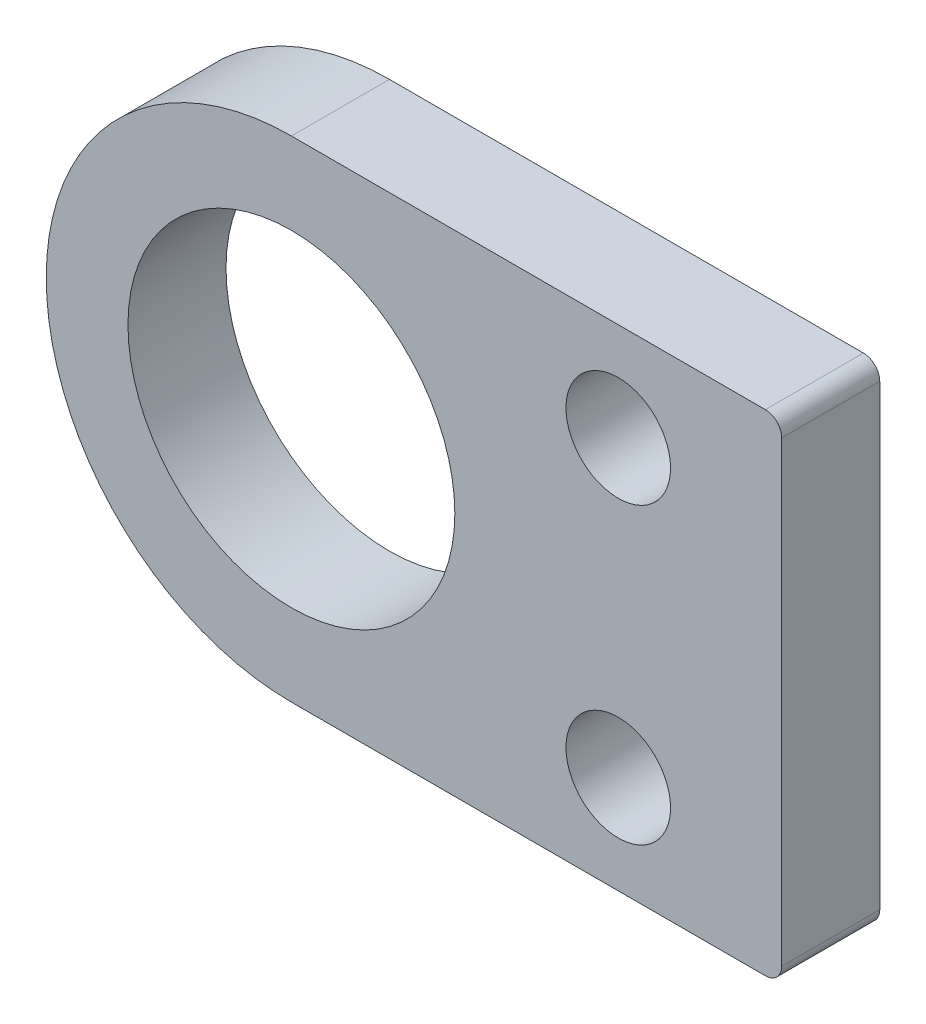
ISO-10303-21;
HEADER;
FILE_DESCRIPTION(('STEP AP214'),'2;1');
FILE_NAME('part.step','',(''),(''),'','','');
FILE_SCHEMA(('AUTOMOTIVE_DESIGN { 1 0 10303 214 1 1 1 1 }'));
ENDSEC;
DATA;
#1=APPLICATION_CONTEXT('core data for automotive mechanical design processes');
#2=APPLICATION_PROTOCOL_DEFINITION('international standard','automotive_design',2000,#1);
#3=PRODUCT_CONTEXT('',#1,'mechanical');
#4=PRODUCT('Part','Part','',(#3));
#5=PRODUCT_RELATED_PRODUCT_CATEGORY('part','',(#4));
#6=PRODUCT_DEFINITION_FORMATION('','',#4);
#7=PRODUCT_DEFINITION_CONTEXT('part definition',#1,'design');
#8=PRODUCT_DEFINITION('design','',#6,#7);
#9=PRODUCT_DEFINITION_SHAPE('','',#8);
#10=(LENGTH_UNIT() NAMED_UNIT(*) SI_UNIT(.MILLI.,.METRE.));
#11=(NAMED_UNIT(*) PLANE_ANGLE_UNIT() SI_UNIT($,.RADIAN.));
#12=(NAMED_UNIT(*) SI_UNIT($,.STERADIAN.) SOLID_ANGLE_UNIT());
#13=UNCERTAINTY_MEASURE_WITH_UNIT(LENGTH_MEASURE(1.E-05),#10,'distance_accuracy_value','');
#14=(GEOMETRIC_REPRESENTATION_CONTEXT(3) GLOBAL_UNCERTAINTY_ASSIGNED_CONTEXT((#13)) GLOBAL_UNIT_ASSIGNED_CONTEXT((#10,
#11,#12)) REPRESENTATION_CONTEXT('',''));
#15=CARTESIAN_POINT('',(0.,0.,0.));
#16=DIRECTION('',(0.,0.,1.));
#17=DIRECTION('',(1.,0.,0.));
#18=AXIS2_PLACEMENT_3D('',#15,#16,#17);
#19=CARTESIAN_POINT('',(0.,0.,3.));
#20=DIRECTION('',(0.,0.,1.));
#21=DIRECTION('',(1.,0.,0.));
#22=AXIS2_PLACEMENT_3D('',#19,#20,#21);
#23=PLANE('',#22);
#24=CARTESIAN_POINT('',(10.,4.5,3.));
#25=DIRECTION('',(0.,0.,1.));
#26=DIRECTION('',(1.,0.,0.));
#27=AXIS2_PLACEMENT_3D('',#24,#25,#26);
#28=CIRCLE('',#27,1.6);
#29=CARTESIAN_POINT('',(11.6,4.5,3.));
#30=VERTEX_POINT('',#29);
#31=EDGE_CURVE('E254',#30,#30,#28,.T.);
#32=ORIENTED_EDGE('',*,*,#31,.F.);
#33=EDGE_LOOP('',(#32));
#34=FACE_BOUND('',#33,.T.);
#35=DIRECTION('',(1.,0.,0.));
#36=VECTOR('',#35,1.);
#37=CARTESIAN_POINT('',(0.,-7.5,3.));
#38=LINE('',#37,#36);
#39=CARTESIAN_POINT('',(0.,-7.5,3.));
#40=VERTEX_POINT('',#39);
#41=CARTESIAN_POINT('',(14.5,-7.5,3.));
#42=VERTEX_POINT('',#41);
#43=EDGE_CURVE('E87',#40,#42,#38,.T.);
#44=ORIENTED_EDGE('',*,*,#43,.T.);
#45=CARTESIAN_POINT('',(14.5,-7.,3.));
#46=DIRECTION('',(0.,0.,1.));
#47=DIRECTION('',(1.,0.,0.));
#48=AXIS2_PLACEMENT_3D('',#45,#46,#47);
#49=CIRCLE('',#48,0.5);
#50=CARTESIAN_POINT('',(15.,-7.,3.));
#51=VERTEX_POINT('',#50);
#52=EDGE_CURVE('E42',#42,#51,#49,.T.);
#53=ORIENTED_EDGE('',*,*,#52,.T.);
#54=DIRECTION('',(0.,1.,0.));
#55=VECTOR('',#54,1.);
#56=CARTESIAN_POINT('',(15.,7.5,3.));
#57=LINE('',#56,#55);
#58=CARTESIAN_POINT('',(15.,7.,3.));
#59=VERTEX_POINT('',#58);
#60=EDGE_CURVE('E94',#51,#59,#57,.T.);
#61=ORIENTED_EDGE('',*,*,#60,.T.);
#62=CARTESIAN_POINT('',(14.5,7.,3.));
#63=DIRECTION('',(0.,0.,1.));
#64=DIRECTION('',(1.,0.,0.));
#65=AXIS2_PLACEMENT_3D('',#62,#63,#64);
#66=CIRCLE('',#65,0.5);
#67=CARTESIAN_POINT('',(14.5,7.5,3.));
#68=VERTEX_POINT('',#67);
#69=EDGE_CURVE('E49',#59,#68,#66,.T.);
#70=ORIENTED_EDGE('',*,*,#69,.T.);
#71=DIRECTION('',(-1.,0.,0.));
#72=VECTOR('',#71,1.);
#73=CARTESIAN_POINT('',(0.,7.5,3.));
#74=LINE('',#73,#72);
#75=CARTESIAN_POINT('',(0.,7.5,3.));
#76=VERTEX_POINT('',#75);
#77=EDGE_CURVE('E99',#68,#76,#74,.T.);
#78=ORIENTED_EDGE('',*,*,#77,.T.);
#79=CARTESIAN_POINT('',(0.,0.,3.));
#80=DIRECTION('',(0.,0.,1.));
#81=DIRECTION('',(1.,0.,0.));
#82=AXIS2_PLACEMENT_3D('',#79,#80,#81);
#83=CIRCLE('',#82,7.5);
#84=EDGE_CURVE('E95',#76,#40,#83,.T.);
#85=ORIENTED_EDGE('',*,*,#84,.T.);
#86=EDGE_LOOP('',(#44,#53,#61,#70,#78,#85));
#87=FACE_BOUND('',#86,.T.);
#88=CARTESIAN_POINT('',(0.,0.,3.));
#89=DIRECTION('',(0.,0.,1.));
#90=DIRECTION('',(1.,0.,0.));
#91=AXIS2_PLACEMENT_3D('',#88,#89,#90);
#92=CIRCLE('',#91,5.);
#93=CARTESIAN_POINT('',(5.,0.,3.));
#94=VERTEX_POINT('',#93);
#95=EDGE_CURVE('E140',#94,#94,#92,.T.);
#96=ORIENTED_EDGE('',*,*,#95,.F.);
#97=EDGE_LOOP('',(#96));
#98=FACE_BOUND('',#97,.T.);
#99=CARTESIAN_POINT('',(10.,-4.5,3.));
#100=DIRECTION('',(0.,0.,1.));
#101=DIRECTION('',(-1.,0.,0.));
#102=AXIS2_PLACEMENT_3D('',#99,#100,#101);
#103=CIRCLE('',#102,1.6);
#104=CARTESIAN_POINT('',(8.4,-4.5,3.));
#105=VERTEX_POINT('',#104);
#106=EDGE_CURVE('E245',#105,#105,#103,.T.);
#107=ORIENTED_EDGE('',*,*,#106,.F.);
#108=EDGE_LOOP('',(#107));
#109=FACE_BOUND('',#108,.T.);
#110=ADVANCED_FACE('F34',(#34,#87,#98,#109),#23,.T.);
#111=CARTESIAN_POINT('',(0.,0.,0.));
#112=DIRECTION('',(0.,0.,1.));
#113=DIRECTION('',(1.,0.,0.));
#114=AXIS2_PLACEMENT_3D('',#111,#112,#113);
#115=PLANE('',#114);
#116=DIRECTION('',(0.,1.,0.));
#117=VECTOR('',#116,1.);
#118=CARTESIAN_POINT('',(15.,7.5,0.));
#119=LINE('',#118,#117);
#120=CARTESIAN_POINT('',(15.,-7.,0.));
#121=VERTEX_POINT('',#120);
#122=CARTESIAN_POINT('',(15.,7.,0.));
#123=VERTEX_POINT('',#122);
#124=EDGE_CURVE('E137',#121,#123,#119,.T.);
#125=ORIENTED_EDGE('',*,*,#124,.F.);
#126=CARTESIAN_POINT('',(14.5,-7.,0.));
#127=DIRECTION('',(0.,0.,1.));
#128=DIRECTION('',(1.,0.,0.));
#129=AXIS2_PLACEMENT_3D('',#126,#127,#128);
#130=CIRCLE('',#129,0.5);
#131=CARTESIAN_POINT('',(14.5,-7.5,0.));
#132=VERTEX_POINT('',#131);
#133=EDGE_CURVE('E120',#121,#132,#130,.F.);
#134=ORIENTED_EDGE('',*,*,#133,.T.);
#135=DIRECTION('',(1.,0.,0.));
#136=VECTOR('',#135,1.);
#137=CARTESIAN_POINT('',(0.,-7.5,0.));
#138=LINE('',#137,#136);
#139=CARTESIAN_POINT('',(0.,-7.5,0.));
#140=VERTEX_POINT('',#139);
#141=EDGE_CURVE('E136',#140,#132,#138,.T.);
#142=ORIENTED_EDGE('',*,*,#141,.F.);
#143=CARTESIAN_POINT('',(0.,0.,0.));
#144=DIRECTION('',(0.,0.,1.));
#145=DIRECTION('',(1.,0.,0.));
#146=AXIS2_PLACEMENT_3D('',#143,#144,#145);
#147=CIRCLE('',#146,7.5);
#148=CARTESIAN_POINT('',(0.,7.5,0.));
#149=VERTEX_POINT('',#148);
#150=EDGE_CURVE('E107',#149,#140,#147,.T.);
#151=ORIENTED_EDGE('',*,*,#150,.F.);
#152=DIRECTION('',(-1.,0.,0.));
#153=VECTOR('',#152,1.);
#154=CARTESIAN_POINT('',(0.,7.5,0.));
#155=LINE('',#154,#153);
#156=CARTESIAN_POINT('',(14.5,7.5,0.));
#157=VERTEX_POINT('',#156);
#158=EDGE_CURVE('E103',#157,#149,#155,.T.);
#159=ORIENTED_EDGE('',*,*,#158,.F.);
#160=CARTESIAN_POINT('',(14.5,7.,0.));
#161=DIRECTION('',(0.,0.,1.));
#162=DIRECTION('',(1.,0.,0.));
#163=AXIS2_PLACEMENT_3D('',#160,#161,#162);
#164=CIRCLE('',#163,0.5);
#165=EDGE_CURVE('E118',#157,#123,#164,.F.);
#166=ORIENTED_EDGE('',*,*,#165,.T.);
#167=EDGE_LOOP('',(#125,#134,#142,#151,#159,#166));
#168=FACE_BOUND('',#167,.T.);
#169=CARTESIAN_POINT('',(0.,0.,0.));
#170=DIRECTION('',(0.,0.,1.));
#171=DIRECTION('',(1.,0.,0.));
#172=AXIS2_PLACEMENT_3D('',#169,#170,#171);
#173=CIRCLE('',#172,5.);
#174=CARTESIAN_POINT('',(5.,0.,0.));
#175=VERTEX_POINT('',#174);
#176=EDGE_CURVE('E257',#175,#175,#173,.T.);
#177=ORIENTED_EDGE('',*,*,#176,.T.);
#178=EDGE_LOOP('',(#177));
#179=FACE_BOUND('',#178,.T.);
#180=CARTESIAN_POINT('',(10.,4.5,0.));
#181=DIRECTION('',(0.,0.,1.));
#182=DIRECTION('',(1.,0.,0.));
#183=AXIS2_PLACEMENT_3D('',#180,#181,#182);
#184=CIRCLE('',#183,1.6);
#185=CARTESIAN_POINT('',(11.6,4.5,0.));
#186=VERTEX_POINT('',#185);
#187=EDGE_CURVE('E251',#186,#186,#184,.T.);
#188=ORIENTED_EDGE('',*,*,#187,.T.);
#189=EDGE_LOOP('',(#188));
#190=FACE_BOUND('',#189,.T.);
#191=CARTESIAN_POINT('',(10.,-4.5,0.));
#192=DIRECTION('',(0.,0.,1.));
#193=DIRECTION('',(-1.,0.,0.));
#194=AXIS2_PLACEMENT_3D('',#191,#192,#193);
#195=CIRCLE('',#194,1.6);
#196=CARTESIAN_POINT('',(8.4,-4.5,0.));
#197=VERTEX_POINT('',#196);
#198=EDGE_CURVE('E248',#197,#197,#195,.T.);
#199=ORIENTED_EDGE('',*,*,#198,.T.);
#200=EDGE_LOOP('',(#199));
#201=FACE_BOUND('',#200,.T.);
#202=ADVANCED_FACE('F134',(#168,#179,#190,#201),#115,.F.);
#203=CARTESIAN_POINT('',(0.,0.,3.));
#204=DIRECTION('',(0.,0.,-1.));
#205=DIRECTION('',(-1.,0.,0.));
#206=AXIS2_PLACEMENT_3D('',#203,#204,#205);
#207=CYLINDRICAL_SURFACE('',#206,7.5);
#208=ORIENTED_EDGE('',*,*,#150,.T.);
#209=DIRECTION('',(0.,0.,-1.));
#210=VECTOR('',#209,1.);
#211=CARTESIAN_POINT('',(0.,-7.5,3.));
#212=LINE('',#211,#210);
#213=EDGE_CURVE('E91',#40,#140,#212,.T.);
#214=ORIENTED_EDGE('',*,*,#213,.F.);
#215=ORIENTED_EDGE('',*,*,#84,.F.);
#216=DIRECTION('',(0.,0.,-1.));
#217=VECTOR('',#216,1.);
#218=CARTESIAN_POINT('',(0.,7.5,3.));
#219=LINE('',#218,#217);
#220=EDGE_CURVE('E109',#76,#149,#219,.T.);
#221=ORIENTED_EDGE('',*,*,#220,.T.);
#222=EDGE_LOOP('',(#208,#214,#215,#221));
#223=FACE_BOUND('',#222,.T.);
#224=ADVANCED_FACE('F105',(#223),#207,.T.);
#225=CARTESIAN_POINT('',(0.,-7.5,3.));
#226=DIRECTION('',(0.,1.,0.));
#227=DIRECTION('',(0.,0.,1.));
#228=AXIS2_PLACEMENT_3D('',#225,#226,#227);
#229=PLANE('',#228);
#230=ORIENTED_EDGE('',*,*,#141,.T.);
#231=DIRECTION('',(0.,0.,-1.));
#232=VECTOR('',#231,1.);
#233=CARTESIAN_POINT('',(14.5,-7.5,3.));
#234=LINE('',#233,#232);
#235=EDGE_CURVE('E57',#132,#42,#234,.F.);
#236=ORIENTED_EDGE('',*,*,#235,.T.);
#237=ORIENTED_EDGE('',*,*,#43,.F.);
#238=ORIENTED_EDGE('',*,*,#213,.T.);
#239=EDGE_LOOP('',(#230,#236,#237,#238));
#240=FACE_BOUND('',#239,.T.);
#241=ADVANCED_FACE('F89',(#240),#229,.F.);
#242=CARTESIAN_POINT('',(15.,7.5,3.));
#243=DIRECTION('',(-1.,0.,0.));
#244=DIRECTION('',(0.,-1.,0.));
#245=AXIS2_PLACEMENT_3D('',#242,#243,#244);
#246=PLANE('',#245);
#247=ORIENTED_EDGE('',*,*,#60,.F.);
#248=DIRECTION('',(0.,0.,-1.));
#249=VECTOR('',#248,1.);
#250=CARTESIAN_POINT('',(15.,-7.,3.));
#251=LINE('',#250,#249);
#252=EDGE_CURVE('E111',#51,#121,#251,.T.);
#253=ORIENTED_EDGE('',*,*,#252,.T.);
#254=ORIENTED_EDGE('',*,*,#124,.T.);
#255=DIRECTION('',(0.,0.,-1.));
#256=VECTOR('',#255,1.);
#257=CARTESIAN_POINT('',(15.,7.,3.));
#258=LINE('',#257,#256);
#259=EDGE_CURVE('E108',#123,#59,#258,.F.);
#260=ORIENTED_EDGE('',*,*,#259,.T.);
#261=EDGE_LOOP('',(#247,#253,#254,#260));
#262=FACE_BOUND('',#261,.T.);
#263=ADVANCED_FACE('F127',(#262),#246,.F.);
#264=CARTESIAN_POINT('',(0.,7.5,3.));
#265=DIRECTION('',(0.,-1.,0.));
#266=DIRECTION('',(0.,0.,-1.));
#267=AXIS2_PLACEMENT_3D('',#264,#265,#266);
#268=PLANE('',#267);
#269=ORIENTED_EDGE('',*,*,#77,.F.);
#270=DIRECTION('',(0.,0.,-1.));
#271=VECTOR('',#270,1.);
#272=CARTESIAN_POINT('',(14.5,7.5,3.));
#273=LINE('',#272,#271);
#274=EDGE_CURVE('E11',#68,#157,#273,.T.);
#275=ORIENTED_EDGE('',*,*,#274,.T.);
#276=ORIENTED_EDGE('',*,*,#158,.T.);
#277=ORIENTED_EDGE('',*,*,#220,.F.);
#278=EDGE_LOOP('',(#269,#275,#276,#277));
#279=FACE_BOUND('',#278,.T.);
#280=ADVANCED_FACE('F145',(#279),#268,.F.);
#281=CARTESIAN_POINT('',(0.,0.,3.));
#282=DIRECTION('',(0.,0.,-1.));
#283=DIRECTION('',(-1.,0.,0.));
#284=AXIS2_PLACEMENT_3D('',#281,#282,#283);
#285=CYLINDRICAL_SURFACE('',#284,5.);
#286=ORIENTED_EDGE('',*,*,#95,.T.);
#287=EDGE_LOOP('',(#286));
#288=FACE_BOUND('',#287,.T.);
#289=ORIENTED_EDGE('',*,*,#176,.F.);
#290=EDGE_LOOP('',(#289));
#291=FACE_BOUND('',#290,.T.);
#292=ADVANCED_FACE('F162',(#288,#291),#285,.F.);
#293=CARTESIAN_POINT('',(10.,4.5,3.));
#294=DIRECTION('',(0.,0.,-1.));
#295=DIRECTION('',(-1.,0.,0.));
#296=AXIS2_PLACEMENT_3D('',#293,#294,#295);
#297=CYLINDRICAL_SURFACE('',#296,1.6);
#298=ORIENTED_EDGE('',*,*,#31,.T.);
#299=EDGE_LOOP('',(#298));
#300=FACE_BOUND('',#299,.T.);
#301=ORIENTED_EDGE('',*,*,#187,.F.);
#302=EDGE_LOOP('',(#301));
#303=FACE_BOUND('',#302,.T.);
#304=ADVANCED_FACE('F195',(#300,#303),#297,.F.);
#305=CARTESIAN_POINT('',(10.,-4.5,3.));
#306=DIRECTION('',(0.,0.,-1.));
#307=DIRECTION('',(-1.,0.,0.));
#308=AXIS2_PLACEMENT_3D('',#305,#306,#307);
#309=CYLINDRICAL_SURFACE('',#308,1.6);
#310=ORIENTED_EDGE('',*,*,#106,.T.);
#311=EDGE_LOOP('',(#310));
#312=FACE_BOUND('',#311,.T.);
#313=ORIENTED_EDGE('',*,*,#198,.F.);
#314=EDGE_LOOP('',(#313));
#315=FACE_BOUND('',#314,.T.);
#316=ADVANCED_FACE('F152',(#312,#315),#309,.F.);
#317=CARTESIAN_POINT('',(14.5,-7.,3.));
#318=DIRECTION('',(0.,0.,-1.));
#319=DIRECTION('',(-1.,0.,0.));
#320=AXIS2_PLACEMENT_3D('',#317,#318,#319);
#321=CYLINDRICAL_SURFACE('',#320,0.5);
#322=ORIENTED_EDGE('',*,*,#52,.F.);
#323=ORIENTED_EDGE('',*,*,#235,.F.);
#324=ORIENTED_EDGE('',*,*,#133,.F.);
#325=ORIENTED_EDGE('',*,*,#252,.F.);
#326=EDGE_LOOP('',(#322,#323,#324,#325));
#327=FACE_BOUND('',#326,.T.);
#328=ADVANCED_FACE('F132',(#327),#321,.T.);
#329=CARTESIAN_POINT('',(14.5,7.,3.));
#330=DIRECTION('',(0.,0.,-1.));
#331=DIRECTION('',(-1.,0.,0.));
#332=AXIS2_PLACEMENT_3D('',#329,#330,#331);
#333=CYLINDRICAL_SURFACE('',#332,0.5);
#334=ORIENTED_EDGE('',*,*,#69,.F.);
#335=ORIENTED_EDGE('',*,*,#259,.F.);
#336=ORIENTED_EDGE('',*,*,#165,.F.);
#337=ORIENTED_EDGE('',*,*,#274,.F.);
#338=EDGE_LOOP('',(#334,#335,#336,#337));
#339=FACE_BOUND('',#338,.T.);
#340=ADVANCED_FACE('F36',(#339),#333,.T.);
#341=CLOSED_SHELL('',(#110,#202,#224,#241,#263,#280,#292,#304,#316,#328,#340));
#342=MANIFOLD_SOLID_BREP('B2',#341);
#343=ADVANCED_BREP_SHAPE_REPRESENTATION('',(#18,#342),#14);
#344=SHAPE_DEFINITION_REPRESENTATION(#9,#343);
ENDSEC;
END-ISO-10303-21;
